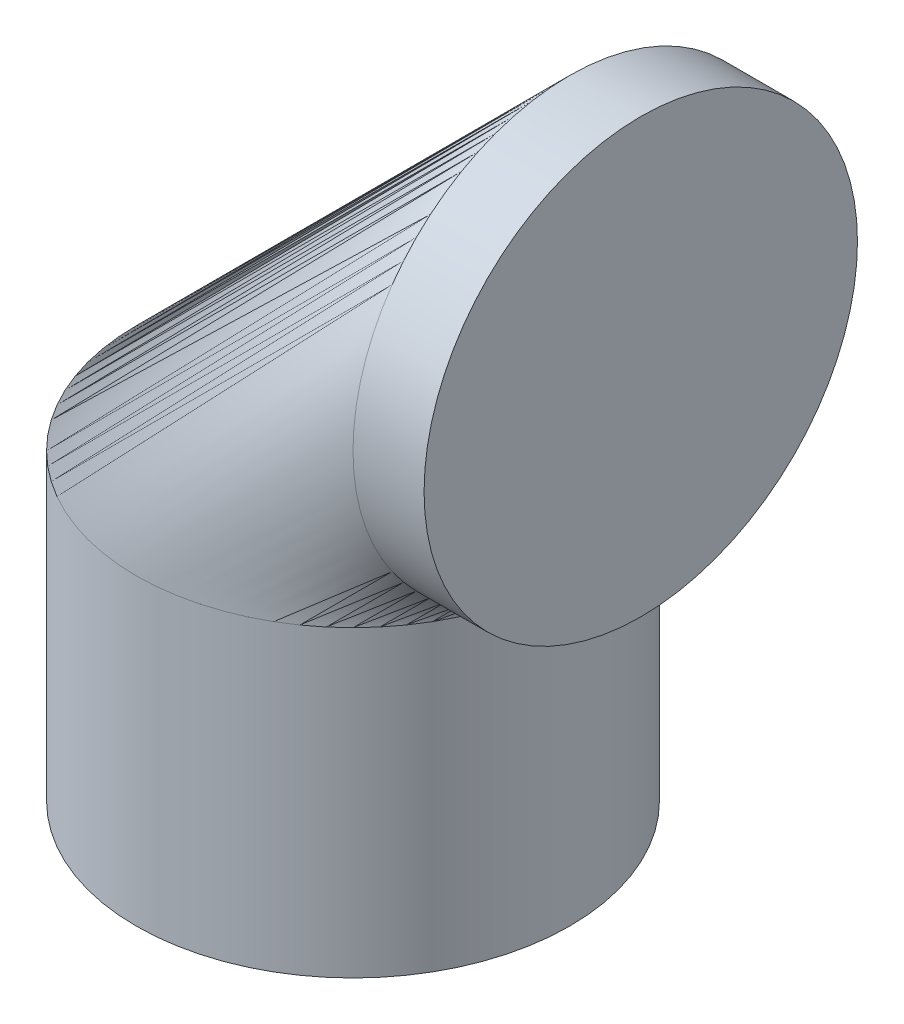
ISO-10303-21;
HEADER;
FILE_DESCRIPTION(('STEP AP214'),'2;1');
FILE_NAME('part.step','',(''),(''),'','','');
FILE_SCHEMA(('AUTOMOTIVE_DESIGN { 1 0 10303 214 1 1 1 1 }'));
ENDSEC;
DATA;
#1=APPLICATION_CONTEXT('core data for automotive mechanical design processes');
#2=APPLICATION_PROTOCOL_DEFINITION('international standard','automotive_design',2000,#1);
#3=PRODUCT_CONTEXT('',#1,'mechanical');
#4=PRODUCT('Part','Part','',(#3));
#5=PRODUCT_RELATED_PRODUCT_CATEGORY('part','',(#4));
#6=PRODUCT_DEFINITION_FORMATION('','',#4);
#7=PRODUCT_DEFINITION_CONTEXT('part definition',#1,'design');
#8=PRODUCT_DEFINITION('design','',#6,#7);
#9=PRODUCT_DEFINITION_SHAPE('','',#8);
#10=(LENGTH_UNIT() NAMED_UNIT(*) SI_UNIT(.MILLI.,.METRE.));
#11=(NAMED_UNIT(*) PLANE_ANGLE_UNIT() SI_UNIT($,.RADIAN.));
#12=(NAMED_UNIT(*) SI_UNIT($,.STERADIAN.) SOLID_ANGLE_UNIT());
#13=UNCERTAINTY_MEASURE_WITH_UNIT(LENGTH_MEASURE(1.E-05),#10,'distance_accuracy_value','');
#14=(GEOMETRIC_REPRESENTATION_CONTEXT(3) GLOBAL_UNCERTAINTY_ASSIGNED_CONTEXT((#13)) GLOBAL_UNIT_ASSIGNED_CONTEXT((#10,
#11,#12)) REPRESENTATION_CONTEXT('',''));
#15=CARTESIAN_POINT('',(0.,0.,0.));
#16=DIRECTION('',(0.,0.,1.));
#17=DIRECTION('',(1.,0.,0.));
#18=AXIS2_PLACEMENT_3D('',#15,#16,#17);
#19=CARTESIAN_POINT('',(0.,0.,0.));
#20=DIRECTION('',(0.,1.,0.));
#21=DIRECTION('',(0.,0.,1.));
#22=AXIS2_PLACEMENT_3D('',#19,#20,#21);
#23=PLANE('',#22);
#24=CARTESIAN_POINT('',(0.,0.,0.));
#25=DIRECTION('',(0.,1.,0.));
#26=DIRECTION('',(0.,0.,1.));
#27=AXIS2_PLACEMENT_3D('',#24,#25,#26);
#28=CIRCLE('',#27,25.);
#29=CARTESIAN_POINT('',(0.,0.,25.));
#30=VERTEX_POINT('',#29);
#31=EDGE_CURVE('E61',#30,#30,#28,.T.);
#32=ORIENTED_EDGE('',*,*,#31,.F.);
#33=EDGE_LOOP('',(#32));
#34=FACE_BOUND('',#33,.T.);
#35=ADVANCED_FACE('F45',(#34),#23,.F.);
#36=CARTESIAN_POINT('',(33.2,60.,0.));
#37=DIRECTION('',(1.,0.,0.));
#38=DIRECTION('',(0.,0.,1.));
#39=AXIS2_PLACEMENT_3D('',#36,#37,#38);
#40=PLANE('',#39);
#41=CARTESIAN_POINT('',(33.2,60.,0.));
#42=DIRECTION('',(1.,0.,0.));
#43=DIRECTION('',(0.,0.,1.));
#44=AXIS2_PLACEMENT_3D('',#41,#42,#43);
#45=CIRCLE('',#44,25.);
#46=CARTESIAN_POINT('',(33.2,60.,25.));
#47=VERTEX_POINT('',#46);
#48=EDGE_CURVE('E13',#47,#47,#45,.T.);
#49=ORIENTED_EDGE('',*,*,#48,.T.);
#50=EDGE_LOOP('',(#49));
#51=FACE_BOUND('',#50,.T.);
#52=ADVANCED_FACE('F68',(#51),#40,.T.);
#53=CARTESIAN_POINT('',(0.,0.,0.));
#54=DIRECTION('',(0.,1.,0.));
#55=DIRECTION('',(0.,0.,1.));
#56=AXIS2_PLACEMENT_3D('',#53,#54,#55);
#57=CYLINDRICAL_SURFACE('',#56,25.);
#58=CARTESIAN_POINT('',(0.,35.,0.));
#59=DIRECTION('',(0.,1.,0.));
#60=DIRECTION('',(0.,0.,1.));
#61=AXIS2_PLACEMENT_3D('',#58,#59,#60);
#62=CIRCLE('',#61,25.);
#63=CARTESIAN_POINT('',(25.,35.,0.));
#64=VERTEX_POINT('',#63);
#65=EDGE_CURVE('E55',#64,#64,#62,.T.);
#66=ORIENTED_EDGE('',*,*,#65,.F.);
#67=EDGE_LOOP('',(#66));
#68=FACE_BOUND('',#67,.T.);
#69=ORIENTED_EDGE('',*,*,#31,.T.);
#70=EDGE_LOOP('',(#69));
#71=FACE_BOUND('',#70,.T.);
#72=ADVANCED_FACE('F56',(#68,#71),#57,.T.);
#73=CARTESIAN_POINT('',(25.,35.,0.));
#74=DIRECTION('',(0.,0.,-1.));
#75=DIRECTION('',(-1.,0.,0.));
#76=AXIS2_PLACEMENT_3D('',#73,#74,#75);
#77=DEGENERATE_TOROIDAL_SURFACE('',#76,25.,25.,.T.);
#78=CARTESIAN_POINT('',(25.,60.,0.));
#79=DIRECTION('',(1.,0.,0.));
#80=DIRECTION('',(0.,0.,1.));
#81=AXIS2_PLACEMENT_3D('',#78,#79,#80);
#82=CIRCLE('',#81,25.);
#83=EDGE_CURVE('E51',#64,#64,#82,.T.);
#84=ORIENTED_EDGE('',*,*,#83,.F.);
#85=ORIENTED_EDGE('',*,*,#65,.T.);
#86=EDGE_LOOP('',(#84,#85));
#87=FACE_BOUND('',#86,.T.);
#88=ADVANCED_FACE('F75',(#87),#77,.T.);
#89=CARTESIAN_POINT('',(25.,60.,0.));
#90=DIRECTION('',(1.,0.,0.));
#91=DIRECTION('',(0.,0.,-1.));
#92=AXIS2_PLACEMENT_3D('',#89,#90,#91);
#93=CYLINDRICAL_SURFACE('',#92,25.);
#94=ORIENTED_EDGE('',*,*,#48,.F.);
#95=EDGE_LOOP('',(#94));
#96=FACE_BOUND('',#95,.T.);
#97=ORIENTED_EDGE('',*,*,#83,.T.);
#98=EDGE_LOOP('',(#97));
#99=FACE_BOUND('',#98,.T.);
#100=ADVANCED_FACE('F73',(#96,#99),#93,.T.);
#101=CLOSED_SHELL('',(#35,#52,#72,#88,#100));
#102=MANIFOLD_SOLID_BREP('B2',#101);
#103=ADVANCED_BREP_SHAPE_REPRESENTATION('',(#18,#102),#14);
#104=SHAPE_DEFINITION_REPRESENTATION(#9,#103);
ENDSEC;
END-ISO-10303-21;
